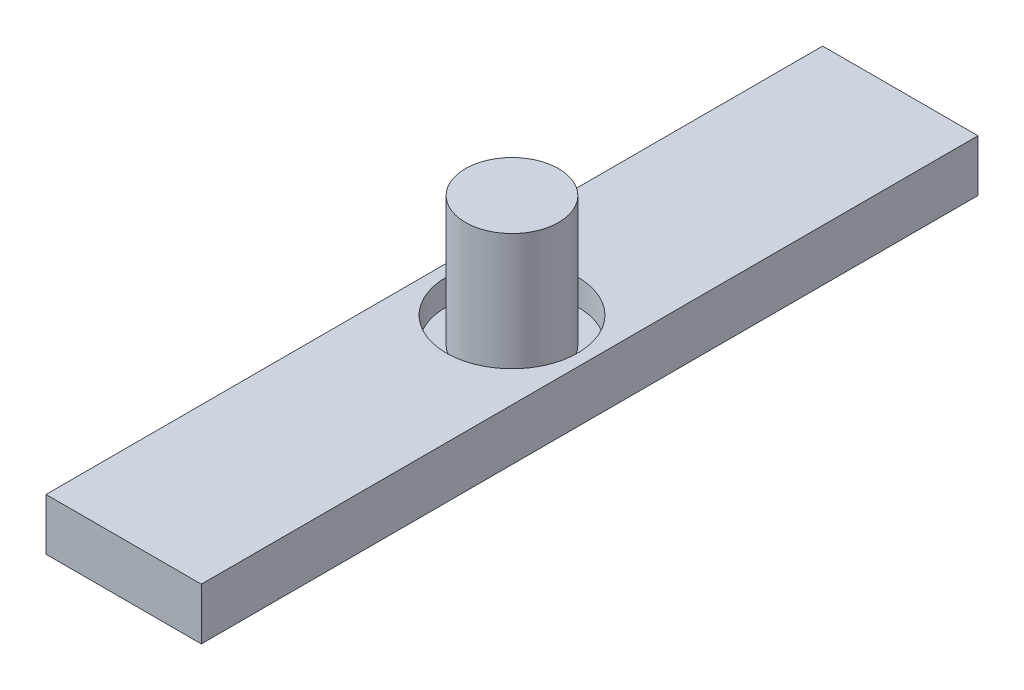
ISO-10303-21;
HEADER;
FILE_DESCRIPTION(('STEP AP214'),'2;1');
FILE_NAME('part.step','',(''),(''),'','','');
FILE_SCHEMA(('AUTOMOTIVE_DESIGN { 1 0 10303 214 1 1 1 1 }'));
ENDSEC;
DATA;
#1=APPLICATION_CONTEXT('core data for automotive mechanical design processes');
#2=APPLICATION_PROTOCOL_DEFINITION('international standard','automotive_design',2000,#1);
#3=PRODUCT_CONTEXT('',#1,'mechanical');
#4=PRODUCT('Part','Part','',(#3));
#5=PRODUCT_RELATED_PRODUCT_CATEGORY('part','',(#4));
#6=PRODUCT_DEFINITION_FORMATION('','',#4);
#7=PRODUCT_DEFINITION_CONTEXT('part definition',#1,'design');
#8=PRODUCT_DEFINITION('design','',#6,#7);
#9=PRODUCT_DEFINITION_SHAPE('','',#8);
#10=(LENGTH_UNIT() NAMED_UNIT(*) SI_UNIT(.MILLI.,.METRE.));
#11=(NAMED_UNIT(*) PLANE_ANGLE_UNIT() SI_UNIT($,.RADIAN.));
#12=(NAMED_UNIT(*) SI_UNIT($,.STERADIAN.) SOLID_ANGLE_UNIT());
#13=UNCERTAINTY_MEASURE_WITH_UNIT(LENGTH_MEASURE(1.E-05),#10,'distance_accuracy_value','');
#14=(GEOMETRIC_REPRESENTATION_CONTEXT(3) GLOBAL_UNCERTAINTY_ASSIGNED_CONTEXT((#13)) GLOBAL_UNIT_ASSIGNED_CONTEXT((#10,
#11,#12)) REPRESENTATION_CONTEXT('',''));
#15=CARTESIAN_POINT('',(0.,0.,0.));
#16=DIRECTION('',(0.,0.,1.));
#17=DIRECTION('',(1.,0.,0.));
#18=AXIS2_PLACEMENT_3D('',#15,#16,#17);
#19=CARTESIAN_POINT('',(-19.813074204947,10.,-30.0671378091873));
#20=DIRECTION('',(1.,0.,0.));
#21=DIRECTION('',(0.,0.,-1.));
#22=AXIS2_PLACEMENT_3D('',#19,#20,#21);
#23=PLANE('',#22);
#24=DIRECTION('',(0.,0.,1.));
#25=VECTOR('',#24,1.);
#26=CARTESIAN_POINT('',(-19.813074204947,0.,-30.0671378091873));
#27=LINE('',#26,#25);
#28=CARTESIAN_POINT('',(-19.813074204947,0.,-30.0671378091873));
#29=VERTEX_POINT('',#28);
#30=CARTESIAN_POINT('',(-19.813074204947,0.,119.932862190813));
#31=VERTEX_POINT('',#30);
#32=EDGE_CURVE('E111',#29,#31,#27,.T.);
#33=ORIENTED_EDGE('',*,*,#32,.T.);
#34=DIRECTION('',(0.,-1.,0.));
#35=VECTOR('',#34,1.);
#36=CARTESIAN_POINT('',(-19.813074204947,10.,119.932862190813));
#37=LINE('',#36,#35);
#38=CARTESIAN_POINT('',(-19.813074204947,10.,119.932862190813));
#39=VERTEX_POINT('',#38);
#40=EDGE_CURVE('E11',#39,#31,#37,.T.);
#41=ORIENTED_EDGE('',*,*,#40,.F.);
#42=DIRECTION('',(0.,0.,1.));
#43=VECTOR('',#42,1.);
#44=CARTESIAN_POINT('',(-19.813074204947,10.,-30.0671378091873));
#45=LINE('',#44,#43);
#46=CARTESIAN_POINT('',(-19.813074204947,10.,-30.0671378091873));
#47=VERTEX_POINT('',#46);
#48=EDGE_CURVE('E95',#47,#39,#45,.T.);
#49=ORIENTED_EDGE('',*,*,#48,.F.);
#50=DIRECTION('',(0.,-1.,0.));
#51=VECTOR('',#50,1.);
#52=CARTESIAN_POINT('',(-19.813074204947,10.,-30.0671378091873));
#53=LINE('',#52,#51);
#54=EDGE_CURVE('E107',#47,#29,#53,.T.);
#55=ORIENTED_EDGE('',*,*,#54,.T.);
#56=EDGE_LOOP('',(#33,#41,#49,#55));
#57=FACE_BOUND('',#56,.T.);
#58=ADVANCED_FACE('F43',(#57),#23,.F.);
#59=CARTESIAN_POINT('',(-19.813074204947,10.,119.932862190813));
#60=DIRECTION('',(0.,0.,-1.));
#61=DIRECTION('',(-1.,0.,0.));
#62=AXIS2_PLACEMENT_3D('',#59,#60,#61);
#63=PLANE('',#62);
#64=DIRECTION('',(1.,0.,0.));
#65=VECTOR('',#64,1.);
#66=CARTESIAN_POINT('',(-19.813074204947,0.,119.932862190813));
#67=LINE('',#66,#65);
#68=CARTESIAN_POINT('',(10.186925795053,0.,119.932862190813));
#69=VERTEX_POINT('',#68);
#70=EDGE_CURVE('E100',#31,#69,#67,.T.);
#71=ORIENTED_EDGE('',*,*,#70,.T.);
#72=DIRECTION('',(0.,-1.,0.));
#73=VECTOR('',#72,1.);
#74=CARTESIAN_POINT('',(10.186925795053,10.,119.932862190813));
#75=LINE('',#74,#73);
#76=CARTESIAN_POINT('',(10.186925795053,10.,119.932862190813));
#77=VERTEX_POINT('',#76);
#78=EDGE_CURVE('E52',#77,#69,#75,.T.);
#79=ORIENTED_EDGE('',*,*,#78,.F.);
#80=DIRECTION('',(1.,0.,0.));
#81=VECTOR('',#80,1.);
#82=CARTESIAN_POINT('',(-19.813074204947,10.,119.932862190813));
#83=LINE('',#82,#81);
#84=EDGE_CURVE('E90',#39,#77,#83,.T.);
#85=ORIENTED_EDGE('',*,*,#84,.F.);
#86=ORIENTED_EDGE('',*,*,#40,.T.);
#87=EDGE_LOOP('',(#71,#79,#85,#86));
#88=FACE_BOUND('',#87,.T.);
#89=ADVANCED_FACE('F99',(#88),#63,.F.);
#90=CARTESIAN_POINT('',(10.186925795053,10.,-30.0671378091873));
#91=DIRECTION('',(-1.,0.,0.));
#92=DIRECTION('',(0.,0.,1.));
#93=AXIS2_PLACEMENT_3D('',#90,#91,#92);
#94=PLANE('',#93);
#95=DIRECTION('',(0.,0.,-1.));
#96=VECTOR('',#95,1.);
#97=CARTESIAN_POINT('',(10.186925795053,0.,-30.0671378091873));
#98=LINE('',#97,#96);
#99=CARTESIAN_POINT('',(10.186925795053,0.,-30.0671378091873));
#100=VERTEX_POINT('',#99);
#101=EDGE_CURVE('E77',#69,#100,#98,.T.);
#102=ORIENTED_EDGE('',*,*,#101,.T.);
#103=DIRECTION('',(0.,-1.,0.));
#104=VECTOR('',#103,1.);
#105=CARTESIAN_POINT('',(10.186925795053,10.,-30.0671378091873));
#106=LINE('',#105,#104);
#107=CARTESIAN_POINT('',(10.186925795053,10.,-30.0671378091873));
#108=VERTEX_POINT('',#107);
#109=EDGE_CURVE('E102',#108,#100,#106,.T.);
#110=ORIENTED_EDGE('',*,*,#109,.F.);
#111=DIRECTION('',(0.,0.,-1.));
#112=VECTOR('',#111,1.);
#113=CARTESIAN_POINT('',(10.186925795053,10.,-30.0671378091873));
#114=LINE('',#113,#112);
#115=EDGE_CURVE('E93',#77,#108,#114,.T.);
#116=ORIENTED_EDGE('',*,*,#115,.F.);
#117=ORIENTED_EDGE('',*,*,#78,.T.);
#118=EDGE_LOOP('',(#102,#110,#116,#117));
#119=FACE_BOUND('',#118,.T.);
#120=ADVANCED_FACE('F103',(#119),#94,.F.);
#121=CARTESIAN_POINT('',(-19.813074204947,10.,-30.0671378091873));
#122=DIRECTION('',(0.,0.,1.));
#123=DIRECTION('',(1.,0.,0.));
#124=AXIS2_PLACEMENT_3D('',#121,#122,#123);
#125=PLANE('',#124);
#126=DIRECTION('',(-1.,0.,0.));
#127=VECTOR('',#126,1.);
#128=CARTESIAN_POINT('',(-19.813074204947,0.,-30.0671378091873));
#129=LINE('',#128,#127);
#130=EDGE_CURVE('E83',#100,#29,#129,.T.);
#131=ORIENTED_EDGE('',*,*,#130,.T.);
#132=ORIENTED_EDGE('',*,*,#54,.F.);
#133=DIRECTION('',(-1.,0.,0.));
#134=VECTOR('',#133,1.);
#135=CARTESIAN_POINT('',(-19.813074204947,10.,-30.0671378091873));
#136=LINE('',#135,#134);
#137=EDGE_CURVE('E60',#108,#47,#136,.T.);
#138=ORIENTED_EDGE('',*,*,#137,.F.);
#139=ORIENTED_EDGE('',*,*,#109,.T.);
#140=EDGE_LOOP('',(#131,#132,#138,#139));
#141=FACE_BOUND('',#140,.T.);
#142=ADVANCED_FACE('F125',(#141),#125,.F.);
#143=CARTESIAN_POINT('',(0.,10.,0.));
#144=DIRECTION('',(0.,1.,0.));
#145=DIRECTION('',(0.,0.,1.));
#146=AXIS2_PLACEMENT_3D('',#143,#144,#145);
#147=PLANE('',#146);
#148=CARTESIAN_POINT('',(-4.813074204947,10.,44.9328621908127));
#149=DIRECTION('',(0.,1.,0.));
#150=DIRECTION('',(0.,0.,1.));
#151=AXIS2_PLACEMENT_3D('',#148,#149,#150);
#152=CIRCLE('',#151,12.7);
#153=CARTESIAN_POINT('',(-4.813074204947,10.,57.6328621908127));
#154=VERTEX_POINT('',#153);
#155=EDGE_CURVE('E132',#154,#154,#152,.T.);
#156=ORIENTED_EDGE('',*,*,#155,.F.);
#157=EDGE_LOOP('',(#156));
#158=FACE_BOUND('',#157,.T.);
#159=ORIENTED_EDGE('',*,*,#48,.T.);
#160=ORIENTED_EDGE('',*,*,#84,.T.);
#161=ORIENTED_EDGE('',*,*,#115,.T.);
#162=ORIENTED_EDGE('',*,*,#137,.T.);
#163=EDGE_LOOP('',(#159,#160,#161,#162));
#164=FACE_BOUND('',#163,.T.);
#165=ADVANCED_FACE('F91',(#158,#164),#147,.T.);
#166=CARTESIAN_POINT('',(0.,0.,0.));
#167=DIRECTION('',(0.,1.,0.));
#168=DIRECTION('',(0.,0.,1.));
#169=AXIS2_PLACEMENT_3D('',#166,#167,#168);
#170=PLANE('',#169);
#171=ORIENTED_EDGE('',*,*,#32,.F.);
#172=ORIENTED_EDGE('',*,*,#130,.F.);
#173=ORIENTED_EDGE('',*,*,#101,.F.);
#174=ORIENTED_EDGE('',*,*,#70,.F.);
#175=EDGE_LOOP('',(#171,#172,#173,#174));
#176=FACE_BOUND('',#175,.T.);
#177=ADVANCED_FACE('F128',(#176),#170,.F.);
#178=CARTESIAN_POINT('',(-4.813074204947,5.,44.9328621908127));
#179=DIRECTION('',(0.,1.,0.));
#180=DIRECTION('',(0.,0.,1.));
#181=AXIS2_PLACEMENT_3D('',#178,#179,#180);
#182=CYLINDRICAL_SURFACE('',#181,12.7);
#183=CARTESIAN_POINT('',(-4.813074204947,5.,44.9328621908127));
#184=DIRECTION('',(0.,1.,0.));
#185=DIRECTION('',(0.,0.,1.));
#186=AXIS2_PLACEMENT_3D('',#183,#184,#185);
#187=CIRCLE('',#186,12.7);
#188=CARTESIAN_POINT('',(-4.813074204947,5.,57.6328621908127));
#189=VERTEX_POINT('',#188);
#190=EDGE_CURVE('E115',#189,#189,#187,.T.);
#191=ORIENTED_EDGE('',*,*,#190,.F.);
#192=EDGE_LOOP('',(#191));
#193=FACE_BOUND('',#192,.T.);
#194=ORIENTED_EDGE('',*,*,#155,.T.);
#195=EDGE_LOOP('',(#194));
#196=FACE_BOUND('',#195,.T.);
#197=ADVANCED_FACE('F160',(#193,#196),#182,.F.);
#198=CARTESIAN_POINT('',(-4.813074204947,5.,44.9328621908127));
#199=DIRECTION('',(0.,1.,0.));
#200=DIRECTION('',(0.,0.,1.));
#201=AXIS2_PLACEMENT_3D('',#198,#199,#200);
#202=PLANE('',#201);
#203=CARTESIAN_POINT('',(-4.813074204947,5.,44.9328621908127));
#204=DIRECTION('',(0.,1.,0.));
#205=DIRECTION('',(0.,0.,1.));
#206=AXIS2_PLACEMENT_3D('',#203,#204,#205);
#207=CIRCLE('',#206,9.);
#208=CARTESIAN_POINT('',(-4.813074204947,5.,53.9328621908127));
#209=VERTEX_POINT('',#208);
#210=EDGE_CURVE('E136',#209,#209,#207,.T.);
#211=ORIENTED_EDGE('',*,*,#210,.F.);
#212=EDGE_LOOP('',(#211));
#213=FACE_BOUND('',#212,.T.);
#214=ORIENTED_EDGE('',*,*,#190,.T.);
#215=EDGE_LOOP('',(#214));
#216=FACE_BOUND('',#215,.T.);
#217=ADVANCED_FACE('F152',(#213,#216),#202,.T.);
#218=CARTESIAN_POINT('',(-4.813074204947,5.,44.9328621908127));
#219=DIRECTION('',(0.,1.,0.));
#220=DIRECTION('',(0.,0.,1.));
#221=AXIS2_PLACEMENT_3D('',#218,#219,#220);
#222=CYLINDRICAL_SURFACE('',#221,9.);
#223=ORIENTED_EDGE('',*,*,#210,.T.);
#224=EDGE_LOOP('',(#223));
#225=FACE_BOUND('',#224,.T.);
#226=CARTESIAN_POINT('',(-4.813074204947,30.,44.9328621908127));
#227=DIRECTION('',(0.,1.,0.));
#228=DIRECTION('',(0.,0.,1.));
#229=AXIS2_PLACEMENT_3D('',#226,#227,#228);
#230=CIRCLE('',#229,9.);
#231=CARTESIAN_POINT('',(-4.813074204947,30.,53.9328621908127));
#232=VERTEX_POINT('',#231);
#233=EDGE_CURVE('E143',#232,#232,#230,.T.);
#234=ORIENTED_EDGE('',*,*,#233,.F.);
#235=EDGE_LOOP('',(#234));
#236=FACE_BOUND('',#235,.T.);
#237=ADVANCED_FACE('F150',(#225,#236),#222,.T.);
#238=CARTESIAN_POINT('',(-4.813074204947,30.,44.9328621908127));
#239=DIRECTION('',(0.,1.,0.));
#240=DIRECTION('',(0.,0.,1.));
#241=AXIS2_PLACEMENT_3D('',#238,#239,#240);
#242=PLANE('',#241);
#243=ORIENTED_EDGE('',*,*,#233,.T.);
#244=EDGE_LOOP('',(#243));
#245=FACE_BOUND('',#244,.T.);
#246=ADVANCED_FACE('F148',(#245),#242,.T.);
#247=CLOSED_SHELL('',(#58,#89,#120,#142,#165,#177,#197,#217,#237,#246));
#248=MANIFOLD_SOLID_BREP('B2',#247);
#249=ADVANCED_BREP_SHAPE_REPRESENTATION('',(#18,#248),#14);
#250=SHAPE_DEFINITION_REPRESENTATION(#9,#249);
ENDSEC;
END-ISO-10303-21;
